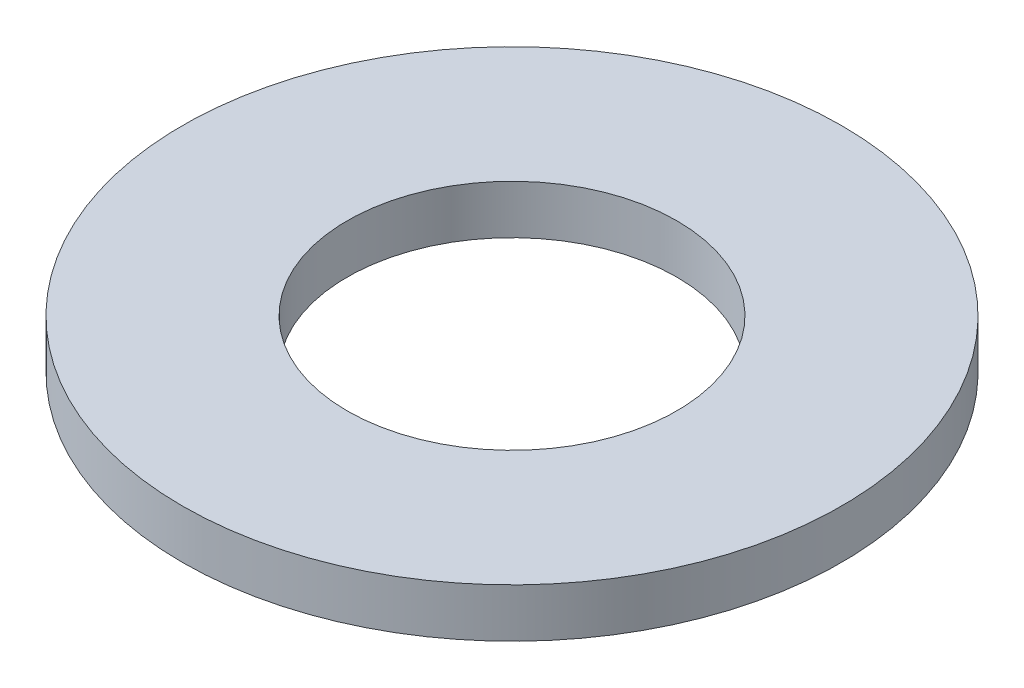
ISO-10303-21;
HEADER;
FILE_DESCRIPTION(('STEP AP214'),'2;1');
FILE_NAME('part.step','',(''),(''),'','','');
FILE_SCHEMA(('AUTOMOTIVE_DESIGN { 1 0 10303 214 1 1 1 1 }'));
ENDSEC;
DATA;
#1=APPLICATION_CONTEXT('core data for automotive mechanical design processes');
#2=APPLICATION_PROTOCOL_DEFINITION('international standard','automotive_design',2000,#1);
#3=PRODUCT_CONTEXT('',#1,'mechanical');
#4=PRODUCT('Part','Part','',(#3));
#5=PRODUCT_RELATED_PRODUCT_CATEGORY('part','',(#4));
#6=PRODUCT_DEFINITION_FORMATION('','',#4);
#7=PRODUCT_DEFINITION_CONTEXT('part definition',#1,'design');
#8=PRODUCT_DEFINITION('design','',#6,#7);
#9=PRODUCT_DEFINITION_SHAPE('','',#8);
#10=(LENGTH_UNIT() NAMED_UNIT(*) SI_UNIT(.MILLI.,.METRE.));
#11=(NAMED_UNIT(*) PLANE_ANGLE_UNIT() SI_UNIT($,.RADIAN.));
#12=(NAMED_UNIT(*) SI_UNIT($,.STERADIAN.) SOLID_ANGLE_UNIT());
#13=UNCERTAINTY_MEASURE_WITH_UNIT(LENGTH_MEASURE(1.E-05),#10,'distance_accuracy_value','');
#14=(GEOMETRIC_REPRESENTATION_CONTEXT(3) GLOBAL_UNCERTAINTY_ASSIGNED_CONTEXT((#13)) GLOBAL_UNIT_ASSIGNED_CONTEXT((#10,
#11,#12)) REPRESENTATION_CONTEXT('',''));
#15=CARTESIAN_POINT('',(0.,0.,0.));
#16=DIRECTION('',(0.,0.,1.));
#17=DIRECTION('',(1.,0.,0.));
#18=AXIS2_PLACEMENT_3D('',#15,#16,#17);
#19=CARTESIAN_POINT('',(0.,0.647699999999996,0.));
#20=DIRECTION('',(0.,1.,0.));
#21=DIRECTION('',(0.,0.,1.));
#22=AXIS2_PLACEMENT_3D('',#19,#20,#21);
#23=PLANE('',#22);
#24=CARTESIAN_POINT('',(0.,0.647699999999996,0.));
#25=DIRECTION('',(0.,1.,0.));
#26=DIRECTION('',(0.,0.,1.));
#27=AXIS2_PLACEMENT_3D('',#24,#25,#26);
#28=CIRCLE('',#27,8.7376);
#29=CARTESIAN_POINT('',(0.,0.647699999999996,8.7376));
#30=VERTEX_POINT('',#29);
#31=EDGE_CURVE('E10',#30,#30,#28,.T.);
#32=ORIENTED_EDGE('',*,*,#31,.T.);
#33=EDGE_LOOP('',(#32));
#34=FACE_BOUND('',#33,.T.);
#35=CARTESIAN_POINT('',(0.,0.647699999999996,0.));
#36=DIRECTION('',(0.,1.,0.));
#37=DIRECTION('',(0.,0.,1.));
#38=AXIS2_PLACEMENT_3D('',#35,#36,#37);
#39=CIRCLE('',#38,4.3688);
#40=CARTESIAN_POINT('',(0.,0.647699999999996,4.3688));
#41=VERTEX_POINT('',#40);
#42=EDGE_CURVE('E44',#41,#41,#39,.T.);
#43=ORIENTED_EDGE('',*,*,#42,.F.);
#44=EDGE_LOOP('',(#43));
#45=FACE_BOUND('',#44,.T.);
#46=ADVANCED_FACE('F37',(#34,#45),#23,.T.);
#47=CARTESIAN_POINT('',(0.,0.647699999999996,0.));
#48=DIRECTION('',(0.,-1.,0.));
#49=DIRECTION('',(0.,0.,-1.));
#50=AXIS2_PLACEMENT_3D('',#47,#48,#49);
#51=CYLINDRICAL_SURFACE('',#50,8.7376);
#52=ORIENTED_EDGE('',*,*,#31,.F.);
#53=EDGE_LOOP('',(#52));
#54=FACE_BOUND('',#53,.T.);
#55=CARTESIAN_POINT('',(0.,-0.647700000000004,0.));
#56=DIRECTION('',(0.,1.,0.));
#57=DIRECTION('',(0.,0.,1.));
#58=AXIS2_PLACEMENT_3D('',#55,#56,#57);
#59=CIRCLE('',#58,8.7376);
#60=CARTESIAN_POINT('',(0.,-0.647700000000004,8.7376));
#61=VERTEX_POINT('',#60);
#62=EDGE_CURVE('E48',#61,#61,#59,.T.);
#63=ORIENTED_EDGE('',*,*,#62,.T.);
#64=EDGE_LOOP('',(#63));
#65=FACE_BOUND('',#64,.T.);
#66=ADVANCED_FACE('F39',(#54,#65),#51,.T.);
#67=CARTESIAN_POINT('',(0.,0.647699999999996,0.));
#68=DIRECTION('',(0.,-1.,0.));
#69=DIRECTION('',(0.,0.,-1.));
#70=AXIS2_PLACEMENT_3D('',#67,#68,#69);
#71=CYLINDRICAL_SURFACE('',#70,4.3688);
#72=ORIENTED_EDGE('',*,*,#42,.T.);
#73=EDGE_LOOP('',(#72));
#74=FACE_BOUND('',#73,.T.);
#75=CARTESIAN_POINT('',(0.,-0.647700000000004,0.));
#76=DIRECTION('',(0.,1.,0.));
#77=DIRECTION('',(0.,0.,1.));
#78=AXIS2_PLACEMENT_3D('',#75,#76,#77);
#79=CIRCLE('',#78,4.3688);
#80=CARTESIAN_POINT('',(0.,-0.647700000000004,4.3688));
#81=VERTEX_POINT('',#80);
#82=EDGE_CURVE('E52',#81,#81,#79,.T.);
#83=ORIENTED_EDGE('',*,*,#82,.F.);
#84=EDGE_LOOP('',(#83));
#85=FACE_BOUND('',#84,.T.);
#86=ADVANCED_FACE('F61',(#74,#85),#71,.F.);
#87=CARTESIAN_POINT('',(0.,-0.647700000000004,0.));
#88=DIRECTION('',(0.,1.,0.));
#89=DIRECTION('',(0.,0.,1.));
#90=AXIS2_PLACEMENT_3D('',#87,#88,#89);
#91=PLANE('',#90);
#92=ORIENTED_EDGE('',*,*,#82,.T.);
#93=EDGE_LOOP('',(#92));
#94=FACE_BOUND('',#93,.T.);
#95=ORIENTED_EDGE('',*,*,#62,.F.);
#96=EDGE_LOOP('',(#95));
#97=FACE_BOUND('',#96,.T.);
#98=ADVANCED_FACE('F58',(#94,#97),#91,.F.);
#99=CLOSED_SHELL('',(#46,#66,#86,#98));
#100=MANIFOLD_SOLID_BREP('B2',#99);
#101=ADVANCED_BREP_SHAPE_REPRESENTATION('',(#18,#100),#14);
#102=SHAPE_DEFINITION_REPRESENTATION(#9,#101);
ENDSEC;
END-ISO-10303-21;
